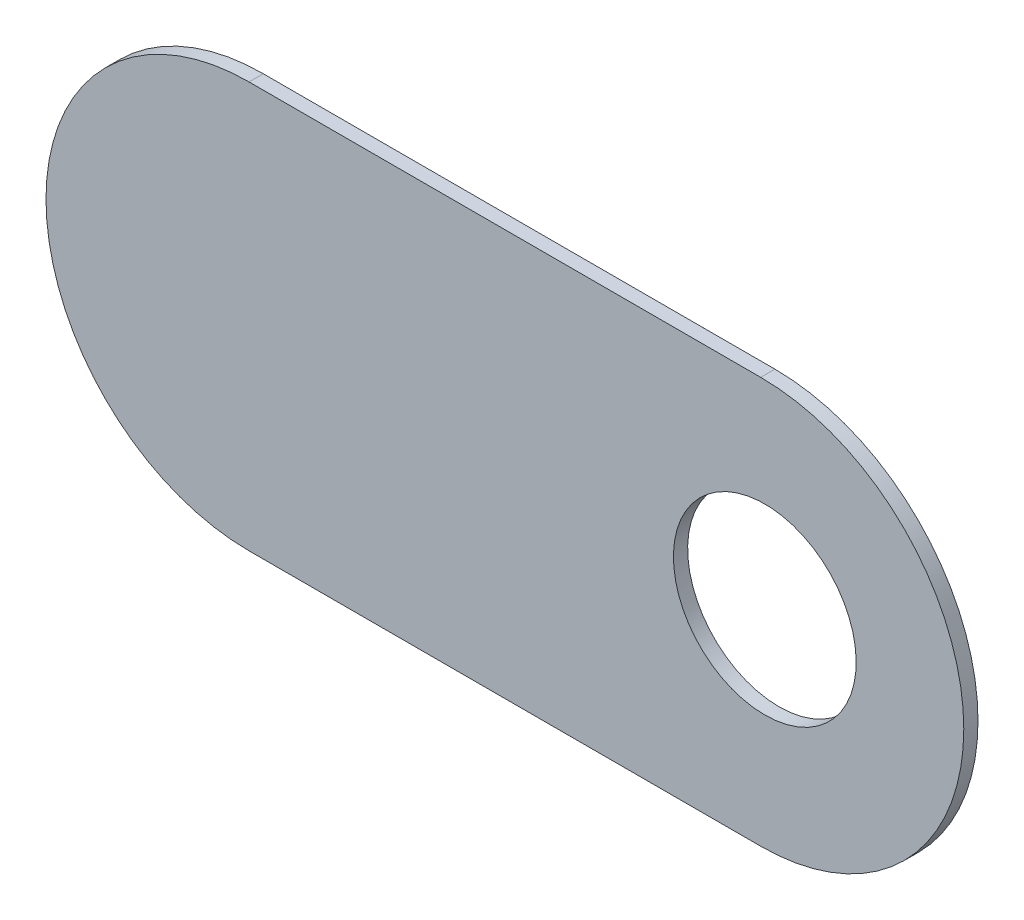
ISO-10303-21;
HEADER;
FILE_DESCRIPTION(('STEP AP214'),'2;1');
FILE_NAME('part.step','',(''),(''),'','','');
FILE_SCHEMA(('AUTOMOTIVE_DESIGN { 1 0 10303 214 1 1 1 1 }'));
ENDSEC;
DATA;
#1=APPLICATION_CONTEXT('core data for automotive mechanical design processes');
#2=APPLICATION_PROTOCOL_DEFINITION('international standard','automotive_design',2000,#1);
#3=PRODUCT_CONTEXT('',#1,'mechanical');
#4=PRODUCT('Part','Part','',(#3));
#5=PRODUCT_RELATED_PRODUCT_CATEGORY('part','',(#4));
#6=PRODUCT_DEFINITION_FORMATION('','',#4);
#7=PRODUCT_DEFINITION_CONTEXT('part definition',#1,'design');
#8=PRODUCT_DEFINITION('design','',#6,#7);
#9=PRODUCT_DEFINITION_SHAPE('','',#8);
#10=(LENGTH_UNIT() NAMED_UNIT(*) SI_UNIT(.MILLI.,.METRE.));
#11=(NAMED_UNIT(*) PLANE_ANGLE_UNIT() SI_UNIT($,.RADIAN.));
#12=(NAMED_UNIT(*) SI_UNIT($,.STERADIAN.) SOLID_ANGLE_UNIT());
#13=UNCERTAINTY_MEASURE_WITH_UNIT(LENGTH_MEASURE(1.E-05),#10,'distance_accuracy_value','');
#14=(GEOMETRIC_REPRESENTATION_CONTEXT(3) GLOBAL_UNCERTAINTY_ASSIGNED_CONTEXT((#13)) GLOBAL_UNIT_ASSIGNED_CONTEXT((#10,
#11,#12)) REPRESENTATION_CONTEXT('',''));
#15=CARTESIAN_POINT('',(0.,0.,0.));
#16=DIRECTION('',(0.,0.,1.));
#17=DIRECTION('',(1.,0.,0.));
#18=AXIS2_PLACEMENT_3D('',#15,#16,#17);
#19=CARTESIAN_POINT('',(120.16,-84.46,-0.045));
#20=DIRECTION('',(0.,0.,-1.));
#21=DIRECTION('',(0.,-1.,0.));
#22=AXIS2_PLACEMENT_3D('',#19,#20,#21);
#23=CYLINDRICAL_SURFACE('',#22,0.225);
#24=CARTESIAN_POINT('',(120.16,-84.46,1.6));
#25=DIRECTION('',(0.,0.,-1.));
#26=DIRECTION('',(0.,-1.,0.));
#27=AXIS2_PLACEMENT_3D('',#24,#25,#26);
#28=CIRCLE('',#27,0.225);
#29=CARTESIAN_POINT('',(120.16,-84.685,1.6));
#30=VERTEX_POINT('',#29);
#31=EDGE_CURVE('E20',#30,#30,#28,.T.);
#32=ORIENTED_EDGE('',*,*,#31,.T.);
#33=DIRECTION('',(0.,0.,1.));
#34=VECTOR('',#33,1.);
#35=CARTESIAN_POINT('',(120.16,-84.685,-0.045));
#36=LINE('',#35,#34);
#37=CARTESIAN_POINT('',(120.16,-84.685,1.635));
#38=VERTEX_POINT('',#37);
#39=EDGE_CURVE('E11',#30,#38,#36,.T.);
#40=ORIENTED_EDGE('',*,*,#39,.T.);
#41=CARTESIAN_POINT('',(120.16,-84.46,1.635));
#42=DIRECTION('',(0.,0.,-1.));
#43=DIRECTION('',(0.,-1.,0.));
#44=AXIS2_PLACEMENT_3D('',#41,#42,#43);
#45=CIRCLE('',#44,0.225);
#46=EDGE_CURVE('E26',#38,#38,#45,.T.);
#47=ORIENTED_EDGE('',*,*,#46,.F.);
#48=ORIENTED_EDGE('',*,*,#39,.F.);
#49=EDGE_LOOP('',(#32,#40,#47,#48));
#50=FACE_BOUND('',#49,.T.);
#51=ADVANCED_FACE('F17',(#50),#23,.F.);
#52=CARTESIAN_POINT('',(120.15,-83.97,1.6));
#53=DIRECTION('',(0.,-1.,0.));
#54=DIRECTION('',(0.,0.,-1.));
#55=AXIS2_PLACEMENT_3D('',#52,#53,#54);
#56=PLANE('',#55);
#57=DIRECTION('',(-1.,0.,0.));
#58=VECTOR('',#57,1.);
#59=CARTESIAN_POINT('',(120.15,-83.97,1.6));
#60=LINE('',#59,#58);
#61=CARTESIAN_POINT('',(120.15,-83.97,1.6));
#62=VERTEX_POINT('',#61);
#63=CARTESIAN_POINT('',(118.89,-83.97,1.6));
#64=VERTEX_POINT('',#63);
#65=EDGE_CURVE('E131',#62,#64,#60,.T.);
#66=ORIENTED_EDGE('',*,*,#65,.T.);
#67=DIRECTION('',(0.,0.,1.));
#68=VECTOR('',#67,1.);
#69=CARTESIAN_POINT('',(118.89,-83.97,1.6));
#70=LINE('',#69,#68);
#71=CARTESIAN_POINT('',(118.89,-83.97,1.635));
#72=VERTEX_POINT('',#71);
#73=EDGE_CURVE('E85',#64,#72,#70,.T.);
#74=ORIENTED_EDGE('',*,*,#73,.T.);
#75=DIRECTION('',(-1.,0.,0.));
#76=VECTOR('',#75,1.);
#77=CARTESIAN_POINT('',(120.15,-83.97,1.635));
#78=LINE('',#77,#76);
#79=CARTESIAN_POINT('',(120.15,-83.97,1.635));
#80=VERTEX_POINT('',#79);
#81=EDGE_CURVE('E116',#80,#72,#78,.T.);
#82=ORIENTED_EDGE('',*,*,#81,.F.);
#83=DIRECTION('',(0.,0.,1.));
#84=VECTOR('',#83,1.);
#85=CARTESIAN_POINT('',(120.15,-83.97,1.6));
#86=LINE('',#85,#84);
#87=EDGE_CURVE('E120',#62,#80,#86,.T.);
#88=ORIENTED_EDGE('',*,*,#87,.F.);
#89=EDGE_LOOP('',(#66,#74,#82,#88));
#90=FACE_BOUND('',#89,.T.);
#91=ADVANCED_FACE('F155',(#90),#56,.F.);
#92=CARTESIAN_POINT('',(118.89,-84.97,1.635));
#93=DIRECTION('',(0.,0.,1.));
#94=DIRECTION('',(1.,0.,0.));
#95=AXIS2_PLACEMENT_3D('',#92,#93,#94);
#96=PLANE('',#95);
#97=ORIENTED_EDGE('',*,*,#46,.T.);
#98=EDGE_LOOP('',(#97));
#99=FACE_BOUND('',#98,.T.);
#100=DIRECTION('',(1.,0.,0.));
#101=VECTOR('',#100,1.);
#102=CARTESIAN_POINT('',(118.89,-84.97,1.635));
#103=LINE('',#102,#101);
#104=CARTESIAN_POINT('',(118.89,-84.97,1.635));
#105=VERTEX_POINT('',#104);
#106=CARTESIAN_POINT('',(120.15,-84.97,1.635));
#107=VERTEX_POINT('',#106);
#108=EDGE_CURVE('E97',#105,#107,#103,.T.);
#109=ORIENTED_EDGE('',*,*,#108,.T.);
#110=CARTESIAN_POINT('',(120.15,-84.47,1.635));
#111=DIRECTION('',(0.,0.,1.));
#112=DIRECTION('',(0.,-1.,0.));
#113=AXIS2_PLACEMENT_3D('',#110,#111,#112);
#114=CIRCLE('',#113,0.5);
#115=EDGE_CURVE('E127',#107,#80,#114,.T.);
#116=ORIENTED_EDGE('',*,*,#115,.T.);
#117=ORIENTED_EDGE('',*,*,#81,.T.);
#118=CARTESIAN_POINT('',(118.89,-84.47,1.635));
#119=DIRECTION('',(0.,0.,1.));
#120=DIRECTION('',(0.,1.,0.));
#121=AXIS2_PLACEMENT_3D('',#118,#119,#120);
#122=CIRCLE('',#121,0.5);
#123=EDGE_CURVE('E89',#72,#105,#122,.T.);
#124=ORIENTED_EDGE('',*,*,#123,.T.);
#125=EDGE_LOOP('',(#109,#116,#117,#124));
#126=FACE_BOUND('',#125,.T.);
#127=ADVANCED_FACE('F145',(#99,#126),#96,.T.);
#128=CARTESIAN_POINT('',(118.89,-84.97,1.6));
#129=DIRECTION('',(0.,0.,1.));
#130=DIRECTION('',(1.,0.,0.));
#131=AXIS2_PLACEMENT_3D('',#128,#129,#130);
#132=PLANE('',#131);
#133=ORIENTED_EDGE('',*,*,#31,.F.);
#134=EDGE_LOOP('',(#133));
#135=FACE_BOUND('',#134,.T.);
#136=CARTESIAN_POINT('',(118.89,-84.47,1.6));
#137=DIRECTION('',(0.,0.,1.));
#138=DIRECTION('',(0.,1.,0.));
#139=AXIS2_PLACEMENT_3D('',#136,#137,#138);
#140=CIRCLE('',#139,0.5);
#141=CARTESIAN_POINT('',(118.89,-84.97,1.6));
#142=VERTEX_POINT('',#141);
#143=EDGE_CURVE('E78',#64,#142,#140,.T.);
#144=ORIENTED_EDGE('',*,*,#143,.F.);
#145=ORIENTED_EDGE('',*,*,#65,.F.);
#146=CARTESIAN_POINT('',(120.15,-84.47,1.6));
#147=DIRECTION('',(0.,0.,1.));
#148=DIRECTION('',(0.,-1.,0.));
#149=AXIS2_PLACEMENT_3D('',#146,#147,#148);
#150=CIRCLE('',#149,0.5);
#151=CARTESIAN_POINT('',(120.15,-84.97,1.6));
#152=VERTEX_POINT('',#151);
#153=EDGE_CURVE('E102',#152,#62,#150,.T.);
#154=ORIENTED_EDGE('',*,*,#153,.F.);
#155=DIRECTION('',(1.,0.,0.));
#156=VECTOR('',#155,1.);
#157=CARTESIAN_POINT('',(118.89,-84.97,1.6));
#158=LINE('',#157,#156);
#159=EDGE_CURVE('E95',#142,#152,#158,.T.);
#160=ORIENTED_EDGE('',*,*,#159,.F.);
#161=EDGE_LOOP('',(#144,#145,#154,#160));
#162=FACE_BOUND('',#161,.T.);
#163=ADVANCED_FACE('F100',(#135,#162),#132,.F.);
#164=CARTESIAN_POINT('',(120.15,-84.47,1.6));
#165=DIRECTION('',(0.,0.,-1.));
#166=DIRECTION('',(0.,-1.,0.));
#167=AXIS2_PLACEMENT_3D('',#164,#165,#166);
#168=CYLINDRICAL_SURFACE('',#167,0.5);
#169=ORIENTED_EDGE('',*,*,#153,.T.);
#170=ORIENTED_EDGE('',*,*,#87,.T.);
#171=ORIENTED_EDGE('',*,*,#115,.F.);
#172=DIRECTION('',(0.,0.,1.));
#173=VECTOR('',#172,1.);
#174=CARTESIAN_POINT('',(120.15,-84.97,1.6));
#175=LINE('',#174,#173);
#176=EDGE_CURVE('E105',#152,#107,#175,.T.);
#177=ORIENTED_EDGE('',*,*,#176,.F.);
#178=EDGE_LOOP('',(#169,#170,#171,#177));
#179=FACE_BOUND('',#178,.T.);
#180=ADVANCED_FACE('F144',(#179),#168,.T.);
#181=CARTESIAN_POINT('',(118.89,-84.47,1.6));
#182=DIRECTION('',(0.,0.,-1.));
#183=DIRECTION('',(0.,1.,0.));
#184=AXIS2_PLACEMENT_3D('',#181,#182,#183);
#185=CYLINDRICAL_SURFACE('',#184,0.5);
#186=ORIENTED_EDGE('',*,*,#143,.T.);
#187=DIRECTION('',(0.,0.,1.));
#188=VECTOR('',#187,1.);
#189=CARTESIAN_POINT('',(118.89,-84.97,1.6));
#190=LINE('',#189,#188);
#191=EDGE_CURVE('E82',#142,#105,#190,.T.);
#192=ORIENTED_EDGE('',*,*,#191,.T.);
#193=ORIENTED_EDGE('',*,*,#123,.F.);
#194=ORIENTED_EDGE('',*,*,#73,.F.);
#195=EDGE_LOOP('',(#186,#192,#193,#194));
#196=FACE_BOUND('',#195,.T.);
#197=ADVANCED_FACE('F80',(#196),#185,.T.);
#198=CARTESIAN_POINT('',(118.89,-84.97,1.6));
#199=DIRECTION('',(0.,1.,0.));
#200=DIRECTION('',(1.,0.,0.));
#201=AXIS2_PLACEMENT_3D('',#198,#199,#200);
#202=PLANE('',#201);
#203=ORIENTED_EDGE('',*,*,#159,.T.);
#204=ORIENTED_EDGE('',*,*,#176,.T.);
#205=ORIENTED_EDGE('',*,*,#108,.F.);
#206=ORIENTED_EDGE('',*,*,#191,.F.);
#207=EDGE_LOOP('',(#203,#204,#205,#206));
#208=FACE_BOUND('',#207,.T.);
#209=ADVANCED_FACE('F93',(#208),#202,.F.);
#210=CLOSED_SHELL('',(#51,#91,#127,#163,#180,#197,#209));
#211=MANIFOLD_SOLID_BREP('B1',#210);
#212=ADVANCED_BREP_SHAPE_REPRESENTATION('',(#18,#211),#14);
#213=SHAPE_DEFINITION_REPRESENTATION(#9,#212);
ENDSEC;
END-ISO-10303-21;
